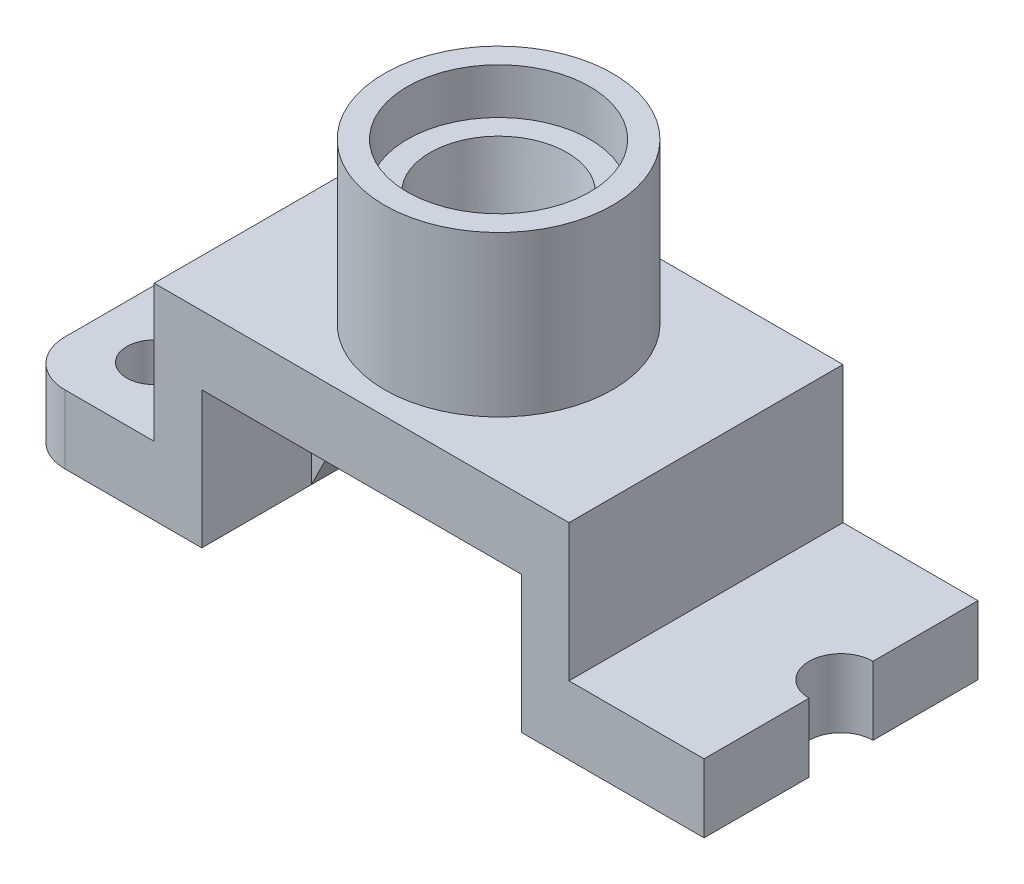
ISO-10303-21;
HEADER;
FILE_DESCRIPTION(('STEP AP214'),'2;1');
FILE_NAME('part.step','',(''),(''),'','','');
FILE_SCHEMA(('AUTOMOTIVE_DESIGN { 1 0 10303 214 1 1 1 1 }'));
ENDSEC;
DATA;
#1=APPLICATION_CONTEXT('core data for automotive mechanical design processes');
#2=APPLICATION_PROTOCOL_DEFINITION('international standard','automotive_design',2000,#1);
#3=PRODUCT_CONTEXT('',#1,'mechanical');
#4=PRODUCT('Part','Part','',(#3));
#5=PRODUCT_RELATED_PRODUCT_CATEGORY('part','',(#4));
#6=PRODUCT_DEFINITION_FORMATION('','',#4);
#7=PRODUCT_DEFINITION_CONTEXT('part definition',#1,'design');
#8=PRODUCT_DEFINITION('design','',#6,#7);
#9=PRODUCT_DEFINITION_SHAPE('','',#8);
#10=(LENGTH_UNIT() NAMED_UNIT(*) SI_UNIT(.MILLI.,.METRE.));
#11=(NAMED_UNIT(*) PLANE_ANGLE_UNIT() SI_UNIT($,.RADIAN.));
#12=(NAMED_UNIT(*) SI_UNIT($,.STERADIAN.) SOLID_ANGLE_UNIT());
#13=UNCERTAINTY_MEASURE_WITH_UNIT(LENGTH_MEASURE(1.E-05),#10,'distance_accuracy_value','');
#14=(GEOMETRIC_REPRESENTATION_CONTEXT(3) GLOBAL_UNCERTAINTY_ASSIGNED_CONTEXT((#13)) GLOBAL_UNIT_ASSIGNED_CONTEXT((#10,
#11,#12)) REPRESENTATION_CONTEXT('',''));
#15=CARTESIAN_POINT('',(0.,0.,0.));
#16=DIRECTION('',(0.,0.,1.));
#17=DIRECTION('',(1.,0.,0.));
#18=AXIS2_PLACEMENT_3D('',#15,#16,#17);
#19=CARTESIAN_POINT('',(75.,0.,30.));
#20=DIRECTION('',(-1.,0.,0.));
#21=DIRECTION('',(0.,0.,1.));
#22=AXIS2_PLACEMENT_3D('',#19,#20,#21);
#23=PLANE('',#22);
#24=DIRECTION('',(0.,0.,-1.));
#25=VECTOR('',#24,1.);
#26=CARTESIAN_POINT('',(75.,0.,30.));
#27=LINE('',#26,#25);
#28=CARTESIAN_POINT('',(75.,0.,30.));
#29=VERTEX_POINT('',#28);
#30=CARTESIAN_POINT('',(75.,0.,7.00000000000001));
#31=VERTEX_POINT('',#30);
#32=EDGE_CURVE('E206',#29,#31,#27,.T.);
#33=ORIENTED_EDGE('',*,*,#32,.T.);
#34=DIRECTION('',(0.,1.,0.));
#35=VECTOR('',#34,1.);
#36=CARTESIAN_POINT('',(75.,-7.,7.00000000000001));
#37=LINE('',#36,#35);
#38=CARTESIAN_POINT('',(75.,15.,7.00000000000001));
#39=VERTEX_POINT('',#38);
#40=EDGE_CURVE('E193',#31,#39,#37,.T.);
#41=ORIENTED_EDGE('',*,*,#40,.T.);
#42=DIRECTION('',(0.,0.,-1.));
#43=VECTOR('',#42,1.);
#44=CARTESIAN_POINT('',(75.,15.,30.));
#45=LINE('',#44,#43);
#46=CARTESIAN_POINT('',(75.,15.,30.));
#47=VERTEX_POINT('',#46);
#48=EDGE_CURVE('E203',#47,#39,#45,.T.);
#49=ORIENTED_EDGE('',*,*,#48,.F.);
#50=DIRECTION('',(0.,1.,0.));
#51=VECTOR('',#50,1.);
#52=CARTESIAN_POINT('',(75.,0.,30.));
#53=LINE('',#52,#51);
#54=EDGE_CURVE('E283',#29,#47,#53,.T.);
#55=ORIENTED_EDGE('',*,*,#54,.F.);
#56=EDGE_LOOP('',(#33,#41,#49,#55));
#57=FACE_BOUND('',#56,.T.);
#58=ADVANCED_FACE('F42',(#57),#23,.F.);
#59=CARTESIAN_POINT('',(35.,30.,30.));
#60=DIRECTION('',(1.,0.,0.));
#61=DIRECTION('',(0.,0.,-1.));
#62=AXIS2_PLACEMENT_3D('',#59,#60,#61);
#63=PLANE('',#62);
#64=DIRECTION('',(0.,-1.,0.));
#65=VECTOR('',#64,1.);
#66=CARTESIAN_POINT('',(35.,0.,-6.));
#67=LINE('',#66,#65);
#68=CARTESIAN_POINT('',(35.,30.,-6.));
#69=VERTEX_POINT('',#68);
#70=CARTESIAN_POINT('',(35.,0.,-5.99999999999999));
#71=VERTEX_POINT('',#70);
#72=EDGE_CURVE('E375',#69,#71,#67,.T.);
#73=ORIENTED_EDGE('',*,*,#72,.F.);
#74=DIRECTION('',(0.,0.,-1.));
#75=VECTOR('',#74,1.);
#76=CARTESIAN_POINT('',(35.,30.,30.));
#77=LINE('',#76,#75);
#78=CARTESIAN_POINT('',(35.,30.,-30.));
#79=VERTEX_POINT('',#78);
#80=EDGE_CURVE('E225',#69,#79,#77,.T.);
#81=ORIENTED_EDGE('',*,*,#80,.T.);
#82=DIRECTION('',(0.,-1.,0.));
#83=VECTOR('',#82,1.);
#84=CARTESIAN_POINT('',(35.,30.,-30.));
#85=LINE('',#84,#83);
#86=CARTESIAN_POINT('',(35.,0.,-30.));
#87=VERTEX_POINT('',#86);
#88=EDGE_CURVE('E302',#79,#87,#85,.T.);
#89=ORIENTED_EDGE('',*,*,#88,.T.);
#90=DIRECTION('',(0.,0.,-1.));
#91=VECTOR('',#90,1.);
#92=CARTESIAN_POINT('',(35.,0.,30.));
#93=LINE('',#92,#91);
#94=EDGE_CURVE('E221',#71,#87,#93,.T.);
#95=ORIENTED_EDGE('',*,*,#94,.F.);
#96=EDGE_LOOP('',(#73,#81,#89,#95));
#97=FACE_BOUND('',#96,.T.);
#98=ADVANCED_FACE('F432',(#97),#63,.F.);
#99=CARTESIAN_POINT('',(-35.,0.,30.));
#100=DIRECTION('',(-1.,0.,0.));
#101=DIRECTION('',(0.,0.,1.));
#102=AXIS2_PLACEMENT_3D('',#99,#100,#101);
#103=PLANE('',#102);
#104=DIRECTION('',(0.,1.,0.));
#105=VECTOR('',#104,1.);
#106=CARTESIAN_POINT('',(-35.,0.,-6.));
#107=LINE('',#106,#105);
#108=CARTESIAN_POINT('',(-35.,0.,-5.99999999999999));
#109=VERTEX_POINT('',#108);
#110=CARTESIAN_POINT('',(-35.,30.,-5.99999999999999));
#111=VERTEX_POINT('',#110);
#112=EDGE_CURVE('E391',#109,#111,#107,.T.);
#113=ORIENTED_EDGE('',*,*,#112,.F.);
#114=DIRECTION('',(0.,0.,-1.));
#115=VECTOR('',#114,1.);
#116=CARTESIAN_POINT('',(-35.,0.,30.));
#117=LINE('',#116,#115);
#118=CARTESIAN_POINT('',(-35.,0.,-30.));
#119=VERTEX_POINT('',#118);
#120=EDGE_CURVE('E233',#109,#119,#117,.T.);
#121=ORIENTED_EDGE('',*,*,#120,.T.);
#122=DIRECTION('',(0.,1.,0.));
#123=VECTOR('',#122,1.);
#124=CARTESIAN_POINT('',(-35.,0.,-30.));
#125=LINE('',#124,#123);
#126=CARTESIAN_POINT('',(-35.,30.,-30.));
#127=VERTEX_POINT('',#126);
#128=EDGE_CURVE('E296',#119,#127,#125,.T.);
#129=ORIENTED_EDGE('',*,*,#128,.T.);
#130=DIRECTION('',(0.,0.,-1.));
#131=VECTOR('',#130,1.);
#132=CARTESIAN_POINT('',(-35.,30.,30.));
#133=LINE('',#132,#131);
#134=EDGE_CURVE('E229',#111,#127,#133,.T.);
#135=ORIENTED_EDGE('',*,*,#134,.F.);
#136=EDGE_LOOP('',(#113,#121,#129,#135));
#137=FACE_BOUND('',#136,.T.);
#138=ADVANCED_FACE('F422',(#137),#103,.F.);
#139=CARTESIAN_POINT('',(-75.,15.,30.));
#140=DIRECTION('',(1.,0.,0.));
#141=DIRECTION('',(0.,0.,-1.));
#142=AXIS2_PLACEMENT_3D('',#139,#140,#141);
#143=PLANE('',#142);
#144=DIRECTION('',(0.,0.,-1.));
#145=VECTOR('',#144,1.);
#146=CARTESIAN_POINT('',(-75.,15.,30.));
#147=LINE('',#146,#145);
#148=CARTESIAN_POINT('',(-75.,15.,20.));
#149=VERTEX_POINT('',#148);
#150=CARTESIAN_POINT('',(-75.,15.,-20.));
#151=VERTEX_POINT('',#150);
#152=EDGE_CURVE('E293',#149,#151,#147,.T.);
#153=ORIENTED_EDGE('',*,*,#152,.T.);
#154=DIRECTION('',(0.,-1.,0.));
#155=VECTOR('',#154,1.);
#156=CARTESIAN_POINT('',(-75.,15.,-20.));
#157=LINE('',#156,#155);
#158=CARTESIAN_POINT('',(-75.,0.,-20.));
#159=VERTEX_POINT('',#158);
#160=EDGE_CURVE('E242',#151,#159,#157,.T.);
#161=ORIENTED_EDGE('',*,*,#160,.T.);
#162=DIRECTION('',(0.,0.,-1.));
#163=VECTOR('',#162,1.);
#164=CARTESIAN_POINT('',(-75.,0.,30.));
#165=LINE('',#164,#163);
#166=CARTESIAN_POINT('',(-75.,0.,20.));
#167=VERTEX_POINT('',#166);
#168=EDGE_CURVE('E237',#167,#159,#165,.T.);
#169=ORIENTED_EDGE('',*,*,#168,.F.);
#170=DIRECTION('',(0.,-1.,0.));
#171=VECTOR('',#170,1.);
#172=CARTESIAN_POINT('',(-75.,15.,20.));
#173=LINE('',#172,#171);
#174=EDGE_CURVE('E240',#167,#149,#173,.F.);
#175=ORIENTED_EDGE('',*,*,#174,.T.);
#176=EDGE_LOOP('',(#153,#161,#169,#175));
#177=FACE_BOUND('',#176,.T.);
#178=ADVANCED_FACE('F463',(#177),#143,.F.);
#179=CARTESIAN_POINT('',(-75.,0.,30.));
#180=DIRECTION('',(0.,1.,0.));
#181=DIRECTION('',(0.,0.,1.));
#182=AXIS2_PLACEMENT_3D('',#179,#180,#181);
#183=PLANE('',#182);
#184=CARTESIAN_POINT('',(-60.4225352112676,0.,15.));
#185=DIRECTION('',(0.,1.,0.));
#186=DIRECTION('',(-1.,0.,0.));
#187=AXIS2_PLACEMENT_3D('',#184,#185,#186);
#188=CIRCLE('',#187,5.99999999999999);
#189=CARTESIAN_POINT('',(-66.4225352112676,0.,15.));
#190=VERTEX_POINT('',#189);
#191=EDGE_CURVE('E359',#190,#190,#188,.T.);
#192=ORIENTED_EDGE('',*,*,#191,.T.);
#193=EDGE_LOOP('',(#192));
#194=FACE_BOUND('',#193,.T.);
#195=CARTESIAN_POINT('',(-60.4225352112676,0.,-15.));
#196=DIRECTION('',(0.,1.,0.));
#197=DIRECTION('',(-1.,0.,0.));
#198=AXIS2_PLACEMENT_3D('',#195,#196,#197);
#199=CIRCLE('',#198,6.);
#200=CARTESIAN_POINT('',(-66.4225352112676,0.,-15.));
#201=VERTEX_POINT('',#200);
#202=EDGE_CURVE('E366',#201,#201,#199,.T.);
#203=ORIENTED_EDGE('',*,*,#202,.T.);
#204=EDGE_LOOP('',(#203));
#205=FACE_BOUND('',#204,.T.);
#206=ORIENTED_EDGE('',*,*,#168,.T.);
#207=CARTESIAN_POINT('',(-65.,0.,-20.));
#208=DIRECTION('',(0.,1.,0.));
#209=DIRECTION('',(0.,0.,1.));
#210=AXIS2_PLACEMENT_3D('',#207,#208,#209);
#211=CIRCLE('',#210,10.);
#212=CARTESIAN_POINT('',(-65.,0.,-30.));
#213=VERTEX_POINT('',#212);
#214=EDGE_CURVE('E247',#159,#213,#211,.F.);
#215=ORIENTED_EDGE('',*,*,#214,.T.);
#216=DIRECTION('',(1.,0.,0.));
#217=VECTOR('',#216,1.);
#218=CARTESIAN_POINT('',(-75.,0.,-30.));
#219=LINE('',#218,#217);
#220=EDGE_CURVE('E294',#213,#119,#219,.T.);
#221=ORIENTED_EDGE('',*,*,#220,.T.);
#222=ORIENTED_EDGE('',*,*,#120,.F.);
#223=DIRECTION('',(0.,0.,-1.));
#224=VECTOR('',#223,1.);
#225=CARTESIAN_POINT('',(-35.,0.,6.));
#226=LINE('',#225,#224);
#227=CARTESIAN_POINT('',(-35.,0.,6.00000000000001));
#228=VERTEX_POINT('',#227);
#229=EDGE_CURVE('E275',#228,#109,#226,.T.);
#230=ORIENTED_EDGE('',*,*,#229,.F.);
#231=CARTESIAN_POINT('',(-35.,0.,30.));
#232=VERTEX_POINT('',#231);
#233=EDGE_CURVE('E234',#232,#228,#117,.T.);
#234=ORIENTED_EDGE('',*,*,#233,.F.);
#235=DIRECTION('',(1.,0.,0.));
#236=VECTOR('',#235,1.);
#237=CARTESIAN_POINT('',(-75.,0.,30.));
#238=LINE('',#237,#236);
#239=CARTESIAN_POINT('',(-65.,0.,30.));
#240=VERTEX_POINT('',#239);
#241=EDGE_CURVE('E258',#240,#232,#238,.T.);
#242=ORIENTED_EDGE('',*,*,#241,.F.);
#243=CARTESIAN_POINT('',(-65.,0.,20.));
#244=DIRECTION('',(0.,1.,0.));
#245=DIRECTION('',(0.,0.,1.));
#246=AXIS2_PLACEMENT_3D('',#243,#244,#245);
#247=CIRCLE('',#246,10.);
#248=EDGE_CURVE('E245',#240,#167,#247,.F.);
#249=ORIENTED_EDGE('',*,*,#248,.T.);
#250=EDGE_LOOP('',(#206,#215,#221,#222,#230,#234,#242,#249));
#251=FACE_BOUND('',#250,.T.);
#252=ADVANCED_FACE('F263',(#194,#205,#251),#183,.F.);
#253=ORIENTED_EDGE('',*,*,#233,.T.);
#254=DIRECTION('',(0.,1.,0.));
#255=VECTOR('',#254,1.);
#256=CARTESIAN_POINT('',(-35.,0.,6.));
#257=LINE('',#256,#255);
#258=CARTESIAN_POINT('',(-35.,30.,6.00000000000001));
#259=VERTEX_POINT('',#258);
#260=EDGE_CURVE('E392',#228,#259,#257,.T.);
#261=ORIENTED_EDGE('',*,*,#260,.T.);
#262=CARTESIAN_POINT('',(-35.,30.,30.));
#263=VERTEX_POINT('',#262);
#264=EDGE_CURVE('E230',#263,#259,#133,.T.);
#265=ORIENTED_EDGE('',*,*,#264,.F.);
#266=DIRECTION('',(0.,1.,0.));
#267=VECTOR('',#266,1.);
#268=CARTESIAN_POINT('',(-35.,0.,30.));
#269=LINE('',#268,#267);
#270=EDGE_CURVE('E266',#232,#263,#269,.T.);
#271=ORIENTED_EDGE('',*,*,#270,.F.);
#272=EDGE_LOOP('',(#253,#261,#265,#271));
#273=FACE_BOUND('',#272,.T.);
#274=ADVANCED_FACE('F465',(#273),#103,.F.);
#275=CARTESIAN_POINT('',(-35.,30.,30.));
#276=DIRECTION('',(0.,1.,0.));
#277=DIRECTION('',(0.,0.,1.));
#278=AXIS2_PLACEMENT_3D('',#275,#276,#277);
#279=PLANE('',#278);
#280=CARTESIAN_POINT('',(0.,30.,0.));
#281=DIRECTION('',(0.,-1.,0.));
#282=DIRECTION('',(0.,0.,-1.));
#283=AXIS2_PLACEMENT_3D('',#280,#281,#282);
#284=CIRCLE('',#283,10.);
#285=CARTESIAN_POINT('',(0.,30.,-10.));
#286=VERTEX_POINT('',#285);
#287=EDGE_CURVE('E739',#286,#286,#284,.T.);
#288=ORIENTED_EDGE('',*,*,#287,.F.);
#289=EDGE_LOOP('',(#288));
#290=FACE_BOUND('',#289,.T.);
#291=DIRECTION('',(0.,0.,-1.));
#292=VECTOR('',#291,1.);
#293=CARTESIAN_POINT('',(20.,30.,6.));
#294=LINE('',#293,#292);
#295=CARTESIAN_POINT('',(20.,30.,6.));
#296=VERTEX_POINT('',#295);
#297=CARTESIAN_POINT('',(20.,30.,-6.));
#298=VERTEX_POINT('',#297);
#299=EDGE_CURVE('E389',#296,#298,#294,.T.);
#300=ORIENTED_EDGE('',*,*,#299,.F.);
#301=DIRECTION('',(1.,0.,0.));
#302=VECTOR('',#301,1.);
#303=CARTESIAN_POINT('',(0.,30.,6.));
#304=LINE('',#303,#302);
#305=CARTESIAN_POINT('',(35.,30.,6.));
#306=VERTEX_POINT('',#305);
#307=EDGE_CURVE('E371',#296,#306,#304,.T.);
#308=ORIENTED_EDGE('',*,*,#307,.T.);
#309=CARTESIAN_POINT('',(35.,30.,30.));
#310=VERTEX_POINT('',#309);
#311=EDGE_CURVE('E226',#310,#306,#77,.T.);
#312=ORIENTED_EDGE('',*,*,#311,.F.);
#313=DIRECTION('',(1.,0.,0.));
#314=VECTOR('',#313,1.);
#315=CARTESIAN_POINT('',(-35.,30.,30.));
#316=LINE('',#315,#314);
#317=EDGE_CURVE('E269',#263,#310,#316,.T.);
#318=ORIENTED_EDGE('',*,*,#317,.F.);
#319=ORIENTED_EDGE('',*,*,#264,.T.);
#320=DIRECTION('',(1.,0.,0.));
#321=VECTOR('',#320,1.);
#322=CARTESIAN_POINT('',(0.,30.,6.));
#323=LINE('',#322,#321);
#324=CARTESIAN_POINT('',(-20.,30.,6.));
#325=VERTEX_POINT('',#324);
#326=EDGE_CURVE('E398',#259,#325,#323,.T.);
#327=ORIENTED_EDGE('',*,*,#326,.T.);
#328=DIRECTION('',(0.,0.,-1.));
#329=VECTOR('',#328,1.);
#330=CARTESIAN_POINT('',(-20.,30.,6.));
#331=LINE('',#330,#329);
#332=CARTESIAN_POINT('',(-20.,30.,-6.));
#333=VERTEX_POINT('',#332);
#334=EDGE_CURVE('E400',#325,#333,#331,.T.);
#335=ORIENTED_EDGE('',*,*,#334,.T.);
#336=DIRECTION('',(1.,0.,0.));
#337=VECTOR('',#336,1.);
#338=CARTESIAN_POINT('',(0.,30.,-6.));
#339=LINE('',#338,#337);
#340=EDGE_CURVE('E395',#111,#333,#339,.T.);
#341=ORIENTED_EDGE('',*,*,#340,.F.);
#342=ORIENTED_EDGE('',*,*,#134,.T.);
#343=DIRECTION('',(1.,0.,0.));
#344=VECTOR('',#343,1.);
#345=CARTESIAN_POINT('',(-35.,30.,-30.));
#346=LINE('',#345,#344);
#347=EDGE_CURVE('E299',#127,#79,#346,.T.);
#348=ORIENTED_EDGE('',*,*,#347,.T.);
#349=ORIENTED_EDGE('',*,*,#80,.F.);
#350=DIRECTION('',(1.,0.,0.));
#351=VECTOR('',#350,1.);
#352=CARTESIAN_POINT('',(0.,30.,-6.));
#353=LINE('',#352,#351);
#354=EDGE_CURVE('E362',#298,#69,#353,.T.);
#355=ORIENTED_EDGE('',*,*,#354,.F.);
#356=EDGE_LOOP('',(#300,#308,#312,#318,#319,#327,#335,#341,#342,#348,#349,#355));
#357=FACE_BOUND('',#356,.T.);
#358=ADVANCED_FACE('F420',(#290,#357),#279,.F.);
#359=ORIENTED_EDGE('',*,*,#311,.T.);
#360=DIRECTION('',(0.,-1.,0.));
#361=VECTOR('',#360,1.);
#362=CARTESIAN_POINT('',(35.,0.,6.));
#363=LINE('',#362,#361);
#364=CARTESIAN_POINT('',(35.,0.,6.));
#365=VERTEX_POINT('',#364);
#366=EDGE_CURVE('E378',#306,#365,#363,.T.);
#367=ORIENTED_EDGE('',*,*,#366,.T.);
#368=CARTESIAN_POINT('',(35.,0.,30.));
#369=VERTEX_POINT('',#368);
#370=EDGE_CURVE('E222',#369,#365,#93,.T.);
#371=ORIENTED_EDGE('',*,*,#370,.F.);
#372=DIRECTION('',(0.,-1.,0.));
#373=VECTOR('',#372,1.);
#374=CARTESIAN_POINT('',(35.,30.,30.));
#375=LINE('',#374,#373);
#376=EDGE_CURVE('E279',#310,#369,#375,.T.);
#377=ORIENTED_EDGE('',*,*,#376,.F.);
#378=EDGE_LOOP('',(#359,#367,#371,#377));
#379=FACE_BOUND('',#378,.T.);
#380=ADVANCED_FACE('F444',(#379),#63,.F.);
#381=CARTESIAN_POINT('',(35.,0.,30.));
#382=DIRECTION('',(0.,1.,0.));
#383=DIRECTION('',(0.,0.,1.));
#384=AXIS2_PLACEMENT_3D('',#381,#382,#383);
#385=PLANE('',#384);
#386=CARTESIAN_POINT('',(75.,0.,-6.99999999999999));
#387=VERTEX_POINT('',#386);
#388=CARTESIAN_POINT('',(75.,0.,-30.));
#389=VERTEX_POINT('',#388);
#390=EDGE_CURVE('E213',#387,#389,#27,.T.);
#391=ORIENTED_EDGE('',*,*,#390,.F.);
#392=CARTESIAN_POINT('',(75.,0.,0.));
#393=DIRECTION('',(0.,1.,0.));
#394=DIRECTION('',(0.,0.,1.));
#395=AXIS2_PLACEMENT_3D('',#392,#393,#394);
#396=CIRCLE('',#395,7.);
#397=EDGE_CURVE('E208',#387,#31,#396,.T.);
#398=ORIENTED_EDGE('',*,*,#397,.T.);
#399=ORIENTED_EDGE('',*,*,#32,.F.);
#400=DIRECTION('',(1.,0.,0.));
#401=VECTOR('',#400,1.);
#402=CARTESIAN_POINT('',(35.,0.,30.));
#403=LINE('',#402,#401);
#404=EDGE_CURVE('E281',#369,#29,#403,.T.);
#405=ORIENTED_EDGE('',*,*,#404,.F.);
#406=ORIENTED_EDGE('',*,*,#370,.T.);
#407=DIRECTION('',(0.,0.,-1.));
#408=VECTOR('',#407,1.);
#409=CARTESIAN_POINT('',(35.,0.,6.));
#410=LINE('',#409,#408);
#411=EDGE_CURVE('E381',#365,#71,#410,.T.);
#412=ORIENTED_EDGE('',*,*,#411,.T.);
#413=ORIENTED_EDGE('',*,*,#94,.T.);
#414=DIRECTION('',(1.,0.,0.));
#415=VECTOR('',#414,1.);
#416=CARTESIAN_POINT('',(35.,0.,-30.));
#417=LINE('',#416,#415);
#418=EDGE_CURVE('E305',#87,#389,#417,.T.);
#419=ORIENTED_EDGE('',*,*,#418,.T.);
#420=EDGE_LOOP('',(#391,#398,#399,#405,#406,#412,#413,#419));
#421=FACE_BOUND('',#420,.T.);
#422=ADVANCED_FACE('F354',(#421),#385,.F.);
#423=CARTESIAN_POINT('',(75.,15.,-6.99999999999999));
#424=VERTEX_POINT('',#423);
#425=CARTESIAN_POINT('',(75.,15.,-30.));
#426=VERTEX_POINT('',#425);
#427=EDGE_CURVE('E214',#424,#426,#45,.T.);
#428=ORIENTED_EDGE('',*,*,#427,.F.);
#429=DIRECTION('',(0.,1.,0.));
#430=VECTOR('',#429,1.);
#431=CARTESIAN_POINT('',(75.,-7.,-6.99999999999999));
#432=LINE('',#431,#430);
#433=EDGE_CURVE('E58',#424,#387,#432,.F.);
#434=ORIENTED_EDGE('',*,*,#433,.T.);
#435=ORIENTED_EDGE('',*,*,#390,.T.);
#436=DIRECTION('',(0.,1.,0.));
#437=VECTOR('',#436,1.);
#438=CARTESIAN_POINT('',(75.,0.,-30.));
#439=LINE('',#438,#437);
#440=EDGE_CURVE('E308',#389,#426,#439,.T.);
#441=ORIENTED_EDGE('',*,*,#440,.T.);
#442=EDGE_LOOP('',(#428,#434,#435,#441));
#443=FACE_BOUND('',#442,.T.);
#444=ADVANCED_FACE('F446',(#443),#23,.F.);
#445=CARTESIAN_POINT('',(75.,15.,30.));
#446=DIRECTION('',(0.,-1.,0.));
#447=DIRECTION('',(1.,0.,0.));
#448=AXIS2_PLACEMENT_3D('',#445,#446,#447);
#449=PLANE('',#448);
#450=ORIENTED_EDGE('',*,*,#48,.T.);
#451=CARTESIAN_POINT('',(75.,15.,0.));
#452=DIRECTION('',(0.,-1.,0.));
#453=DIRECTION('',(1.,0.,0.));
#454=AXIS2_PLACEMENT_3D('',#451,#452,#453);
#455=CIRCLE('',#454,7.);
#456=EDGE_CURVE('E46',#39,#424,#455,.T.);
#457=ORIENTED_EDGE('',*,*,#456,.T.);
#458=ORIENTED_EDGE('',*,*,#427,.T.);
#459=DIRECTION('',(-1.,0.,0.));
#460=VECTOR('',#459,1.);
#461=CARTESIAN_POINT('',(75.,15.,-30.));
#462=LINE('',#461,#460);
#463=CARTESIAN_POINT('',(45.4225352112676,15.,-30.));
#464=VERTEX_POINT('',#463);
#465=EDGE_CURVE('E311',#426,#464,#462,.T.);
#466=ORIENTED_EDGE('',*,*,#465,.T.);
#467=DIRECTION('',(0.,0.,-1.));
#468=VECTOR('',#467,1.);
#469=CARTESIAN_POINT('',(45.4225352112676,15.,30.));
#470=LINE('',#469,#468);
#471=CARTESIAN_POINT('',(45.4225352112676,15.,30.));
#472=VERTEX_POINT('',#471);
#473=EDGE_CURVE('E217',#472,#464,#470,.T.);
#474=ORIENTED_EDGE('',*,*,#473,.F.);
#475=DIRECTION('',(-1.,0.,0.));
#476=VECTOR('',#475,1.);
#477=CARTESIAN_POINT('',(75.,15.,30.));
#478=LINE('',#477,#476);
#479=EDGE_CURVE('E212',#47,#472,#478,.T.);
#480=ORIENTED_EDGE('',*,*,#479,.F.);
#481=EDGE_LOOP('',(#450,#457,#458,#466,#474,#480));
#482=FACE_BOUND('',#481,.T.);
#483=ADVANCED_FACE('F210',(#482),#449,.F.);
#484=CARTESIAN_POINT('',(45.4225352112676,15.,30.));
#485=DIRECTION('',(-1.,0.,0.));
#486=DIRECTION('',(0.,-1.,0.));
#487=AXIS2_PLACEMENT_3D('',#484,#485,#486);
#488=PLANE('',#487);
#489=DIRECTION('',(0.,1.,0.));
#490=VECTOR('',#489,1.);
#491=CARTESIAN_POINT('',(45.4225352112676,15.,-30.));
#492=LINE('',#491,#490);
#493=CARTESIAN_POINT('',(45.4225352112676,45.,-30.));
#494=VERTEX_POINT('',#493);
#495=EDGE_CURVE('E313',#464,#494,#492,.T.);
#496=ORIENTED_EDGE('',*,*,#495,.T.);
#497=DIRECTION('',(0.,0.,-1.));
#498=VECTOR('',#497,1.);
#499=CARTESIAN_POINT('',(45.4225352112676,45.,30.));
#500=LINE('',#499,#498);
#501=CARTESIAN_POINT('',(45.4225352112676,45.,30.));
#502=VERTEX_POINT('',#501);
#503=EDGE_CURVE('E325',#502,#494,#500,.T.);
#504=ORIENTED_EDGE('',*,*,#503,.F.);
#505=DIRECTION('',(0.,1.,0.));
#506=VECTOR('',#505,1.);
#507=CARTESIAN_POINT('',(45.4225352112676,15.,30.));
#508=LINE('',#507,#506);
#509=EDGE_CURVE('E286',#472,#502,#508,.T.);
#510=ORIENTED_EDGE('',*,*,#509,.F.);
#511=ORIENTED_EDGE('',*,*,#473,.T.);
#512=EDGE_LOOP('',(#496,#504,#510,#511));
#513=FACE_BOUND('',#512,.T.);
#514=ADVANCED_FACE('F335',(#513),#488,.F.);
#515=CARTESIAN_POINT('',(45.4225352112676,45.,30.));
#516=DIRECTION('',(0.,-1.,0.));
#517=DIRECTION('',(0.,0.,-1.));
#518=AXIS2_PLACEMENT_3D('',#515,#516,#517);
#519=PLANE('',#518);
#520=CARTESIAN_POINT('',(0.,45.,0.));
#521=DIRECTION('',(0.,1.,0.));
#522=DIRECTION('',(0.,0.,1.));
#523=AXIS2_PLACEMENT_3D('',#520,#521,#522);
#524=CIRCLE('',#523,25.);
#525=CARTESIAN_POINT('',(0.,45.,25.));
#526=VERTEX_POINT('',#525);
#527=EDGE_CURVE('E12',#526,#526,#524,.T.);
#528=ORIENTED_EDGE('',*,*,#527,.F.);
#529=EDGE_LOOP('',(#528));
#530=FACE_BOUND('',#529,.T.);
#531=DIRECTION('',(-1.,0.,0.));
#532=VECTOR('',#531,1.);
#533=CARTESIAN_POINT('',(45.4225352112676,45.,-30.));
#534=LINE('',#533,#532);
#535=CARTESIAN_POINT('',(-45.4225352112676,45.,-30.));
#536=VERTEX_POINT('',#535);
#537=EDGE_CURVE('E315',#494,#536,#534,.T.);
#538=ORIENTED_EDGE('',*,*,#537,.T.);
#539=DIRECTION('',(0.,0.,-1.));
#540=VECTOR('',#539,1.);
#541=CARTESIAN_POINT('',(-45.4225352112676,45.,30.));
#542=LINE('',#541,#540);
#543=CARTESIAN_POINT('',(-45.4225352112676,45.,30.));
#544=VERTEX_POINT('',#543);
#545=EDGE_CURVE('E323',#544,#536,#542,.T.);
#546=ORIENTED_EDGE('',*,*,#545,.F.);
#547=DIRECTION('',(-1.,0.,0.));
#548=VECTOR('',#547,1.);
#549=CARTESIAN_POINT('',(45.4225352112676,45.,30.));
#550=LINE('',#549,#548);
#551=EDGE_CURVE('E288',#502,#544,#550,.T.);
#552=ORIENTED_EDGE('',*,*,#551,.F.);
#553=ORIENTED_EDGE('',*,*,#503,.T.);
#554=EDGE_LOOP('',(#538,#546,#552,#553));
#555=FACE_BOUND('',#554,.T.);
#556=ADVANCED_FACE('F344',(#530,#555),#519,.F.);
#557=CARTESIAN_POINT('',(-45.4225352112676,45.,30.));
#558=DIRECTION('',(1.,0.,0.));
#559=DIRECTION('',(0.,1.,0.));
#560=AXIS2_PLACEMENT_3D('',#557,#558,#559);
#561=PLANE('',#560);
#562=DIRECTION('',(0.,-1.,0.));
#563=VECTOR('',#562,1.);
#564=CARTESIAN_POINT('',(-45.4225352112676,45.,-30.));
#565=LINE('',#564,#563);
#566=CARTESIAN_POINT('',(-45.4225352112676,15.,-30.));
#567=VERTEX_POINT('',#566);
#568=EDGE_CURVE('E272',#536,#567,#565,.T.);
#569=ORIENTED_EDGE('',*,*,#568,.T.);
#570=DIRECTION('',(0.,0.,-1.));
#571=VECTOR('',#570,1.);
#572=CARTESIAN_POINT('',(-45.4225352112676,15.,30.));
#573=LINE('',#572,#571);
#574=CARTESIAN_POINT('',(-45.4225352112676,15.,30.));
#575=VERTEX_POINT('',#574);
#576=EDGE_CURVE('E320',#575,#567,#573,.T.);
#577=ORIENTED_EDGE('',*,*,#576,.F.);
#578=DIRECTION('',(0.,-1.,0.));
#579=VECTOR('',#578,1.);
#580=CARTESIAN_POINT('',(-45.4225352112676,45.,30.));
#581=LINE('',#580,#579);
#582=EDGE_CURVE('E290',#544,#575,#581,.T.);
#583=ORIENTED_EDGE('',*,*,#582,.F.);
#584=ORIENTED_EDGE('',*,*,#545,.T.);
#585=EDGE_LOOP('',(#569,#577,#583,#584));
#586=FACE_BOUND('',#585,.T.);
#587=ADVANCED_FACE('F347',(#586),#561,.F.);
#588=CARTESIAN_POINT('',(-45.4225352112676,15.,30.));
#589=DIRECTION('',(0.,-1.,0.));
#590=DIRECTION('',(1.,0.,0.));
#591=AXIS2_PLACEMENT_3D('',#588,#589,#590);
#592=PLANE('',#591);
#593=CARTESIAN_POINT('',(-60.4225352112676,15.,15.));
#594=DIRECTION('',(0.,1.,0.));
#595=DIRECTION('',(-1.,0.,0.));
#596=AXIS2_PLACEMENT_3D('',#593,#594,#595);
#597=CIRCLE('',#596,5.99999999999999);
#598=CARTESIAN_POINT('',(-66.4225352112676,15.,15.));
#599=VERTEX_POINT('',#598);
#600=EDGE_CURVE('E363',#599,#599,#597,.T.);
#601=ORIENTED_EDGE('',*,*,#600,.F.);
#602=EDGE_LOOP('',(#601));
#603=FACE_BOUND('',#602,.T.);
#604=CARTESIAN_POINT('',(-60.4225352112676,15.,-15.));
#605=DIRECTION('',(0.,1.,0.));
#606=DIRECTION('',(-1.,0.,0.));
#607=AXIS2_PLACEMENT_3D('',#604,#605,#606);
#608=CIRCLE('',#607,6.);
#609=CARTESIAN_POINT('',(-66.4225352112676,15.,-15.));
#610=VERTEX_POINT('',#609);
#611=EDGE_CURVE('E207',#610,#610,#608,.T.);
#612=ORIENTED_EDGE('',*,*,#611,.F.);
#613=EDGE_LOOP('',(#612));
#614=FACE_BOUND('',#613,.T.);
#615=DIRECTION('',(-1.,0.,0.));
#616=VECTOR('',#615,1.);
#617=CARTESIAN_POINT('',(-45.4225352112676,15.,-30.));
#618=LINE('',#617,#616);
#619=CARTESIAN_POINT('',(-65.,15.,-30.));
#620=VERTEX_POINT('',#619);
#621=EDGE_CURVE('E267',#567,#620,#618,.T.);
#622=ORIENTED_EDGE('',*,*,#621,.T.);
#623=CARTESIAN_POINT('',(-65.,15.,-20.));
#624=DIRECTION('',(0.,-1.,0.));
#625=DIRECTION('',(1.,0.,0.));
#626=AXIS2_PLACEMENT_3D('',#623,#624,#625);
#627=CIRCLE('',#626,10.);
#628=EDGE_CURVE('E252',#620,#151,#627,.F.);
#629=ORIENTED_EDGE('',*,*,#628,.T.);
#630=ORIENTED_EDGE('',*,*,#152,.F.);
#631=CARTESIAN_POINT('',(-65.,15.,20.));
#632=DIRECTION('',(0.,-1.,0.));
#633=DIRECTION('',(1.,0.,0.));
#634=AXIS2_PLACEMENT_3D('',#631,#632,#633);
#635=CIRCLE('',#634,10.);
#636=CARTESIAN_POINT('',(-65.,15.,30.));
#637=VERTEX_POINT('',#636);
#638=EDGE_CURVE('E66',#149,#637,#635,.F.);
#639=ORIENTED_EDGE('',*,*,#638,.T.);
#640=DIRECTION('',(-1.,0.,0.));
#641=VECTOR('',#640,1.);
#642=CARTESIAN_POINT('',(-45.4225352112676,15.,30.));
#643=LINE('',#642,#641);
#644=EDGE_CURVE('E260',#575,#637,#643,.T.);
#645=ORIENTED_EDGE('',*,*,#644,.F.);
#646=ORIENTED_EDGE('',*,*,#576,.T.);
#647=EDGE_LOOP('',(#622,#629,#630,#639,#645,#646));
#648=FACE_BOUND('',#647,.T.);
#649=ADVANCED_FACE('F497',(#603,#614,#648),#592,.F.);
#650=CARTESIAN_POINT('',(0.,0.,30.));
#651=DIRECTION('',(0.,0.,1.));
#652=DIRECTION('',(1.,0.,0.));
#653=AXIS2_PLACEMENT_3D('',#650,#651,#652);
#654=PLANE('',#653);
#655=ORIENTED_EDGE('',*,*,#644,.T.);
#656=DIRECTION('',(0.,-1.,0.));
#657=VECTOR('',#656,1.);
#658=CARTESIAN_POINT('',(-65.,0.,30.));
#659=LINE('',#658,#657);
#660=EDGE_CURVE('E198',#637,#240,#659,.T.);
#661=ORIENTED_EDGE('',*,*,#660,.T.);
#662=ORIENTED_EDGE('',*,*,#241,.T.);
#663=ORIENTED_EDGE('',*,*,#270,.T.);
#664=ORIENTED_EDGE('',*,*,#317,.T.);
#665=ORIENTED_EDGE('',*,*,#376,.T.);
#666=ORIENTED_EDGE('',*,*,#404,.T.);
#667=ORIENTED_EDGE('',*,*,#54,.T.);
#668=ORIENTED_EDGE('',*,*,#479,.T.);
#669=ORIENTED_EDGE('',*,*,#509,.T.);
#670=ORIENTED_EDGE('',*,*,#551,.T.);
#671=ORIENTED_EDGE('',*,*,#582,.T.);
#672=EDGE_LOOP('',(#655,#661,#662,#663,#664,#665,#666,#667,#668,#669,#670,#671));
#673=FACE_BOUND('',#672,.T.);
#674=ADVANCED_FACE('F257',(#673),#654,.T.);
#675=CARTESIAN_POINT('',(0.,0.,-30.));
#676=DIRECTION('',(0.,0.,1.));
#677=DIRECTION('',(1.,0.,0.));
#678=AXIS2_PLACEMENT_3D('',#675,#676,#677);
#679=PLANE('',#678);
#680=ORIENTED_EDGE('',*,*,#220,.F.);
#681=DIRECTION('',(0.,-1.,0.));
#682=VECTOR('',#681,1.);
#683=CARTESIAN_POINT('',(-65.,0.,-30.));
#684=LINE('',#683,#682);
#685=EDGE_CURVE('E249',#213,#620,#684,.F.);
#686=ORIENTED_EDGE('',*,*,#685,.T.);
#687=ORIENTED_EDGE('',*,*,#621,.F.);
#688=ORIENTED_EDGE('',*,*,#568,.F.);
#689=ORIENTED_EDGE('',*,*,#537,.F.);
#690=ORIENTED_EDGE('',*,*,#495,.F.);
#691=ORIENTED_EDGE('',*,*,#465,.F.);
#692=ORIENTED_EDGE('',*,*,#440,.F.);
#693=ORIENTED_EDGE('',*,*,#418,.F.);
#694=ORIENTED_EDGE('',*,*,#88,.F.);
#695=ORIENTED_EDGE('',*,*,#347,.F.);
#696=ORIENTED_EDGE('',*,*,#128,.F.);
#697=EDGE_LOOP('',(#680,#686,#687,#688,#689,#690,#691,#692,#693,#694,#695,#696));
#698=FACE_BOUND('',#697,.T.);
#699=ADVANCED_FACE('F339',(#698),#679,.F.);
#700=CARTESIAN_POINT('',(-28.,14.,6.));
#701=DIRECTION('',(-0.894427190999916,0.447213595499958,0.));
#702=DIRECTION('',(-0.447213595499958,-0.894427190999916,0.));
#703=AXIS2_PLACEMENT_3D('',#700,#701,#702);
#704=PLANE('',#703);
#705=DIRECTION('',(0.447213595499958,0.894427190999916,0.));
#706=VECTOR('',#705,1.);
#707=CARTESIAN_POINT('',(-28.,14.,-6.));
#708=LINE('',#707,#706);
#709=EDGE_CURVE('E403',#109,#333,#708,.T.);
#710=ORIENTED_EDGE('',*,*,#709,.T.);
#711=ORIENTED_EDGE('',*,*,#334,.F.);
#712=DIRECTION('',(0.447213595499958,0.894427190999916,0.));
#713=VECTOR('',#712,1.);
#714=CARTESIAN_POINT('',(-28.,14.,6.));
#715=LINE('',#714,#713);
#716=EDGE_CURVE('E394',#228,#325,#715,.T.);
#717=ORIENTED_EDGE('',*,*,#716,.F.);
#718=ORIENTED_EDGE('',*,*,#229,.T.);
#719=EDGE_LOOP('',(#710,#711,#717,#718));
#720=FACE_BOUND('',#719,.T.);
#721=ADVANCED_FACE('F413',(#720),#704,.F.);
#722=CARTESIAN_POINT('',(0.,0.,6.));
#723=DIRECTION('',(0.,0.,1.));
#724=DIRECTION('',(1.,0.,0.));
#725=AXIS2_PLACEMENT_3D('',#722,#723,#724);
#726=PLANE('',#725);
#727=ORIENTED_EDGE('',*,*,#260,.F.);
#728=ORIENTED_EDGE('',*,*,#716,.T.);
#729=ORIENTED_EDGE('',*,*,#326,.F.);
#730=EDGE_LOOP('',(#727,#728,#729));
#731=FACE_BOUND('',#730,.T.);
#732=ADVANCED_FACE('F564',(#731),#726,.T.);
#733=CARTESIAN_POINT('',(0.,0.,-6.));
#734=DIRECTION('',(0.,0.,1.));
#735=DIRECTION('',(1.,0.,0.));
#736=AXIS2_PLACEMENT_3D('',#733,#734,#735);
#737=PLANE('',#736);
#738=ORIENTED_EDGE('',*,*,#112,.T.);
#739=ORIENTED_EDGE('',*,*,#340,.T.);
#740=ORIENTED_EDGE('',*,*,#709,.F.);
#741=EDGE_LOOP('',(#738,#739,#740));
#742=FACE_BOUND('',#741,.T.);
#743=ADVANCED_FACE('F417',(#742),#737,.F.);
#744=CARTESIAN_POINT('',(28.,14.,6.));
#745=DIRECTION('',(-0.894427190999916,-0.447213595499958,0.));
#746=DIRECTION('',(0.447213595499958,-0.894427190999916,0.));
#747=AXIS2_PLACEMENT_3D('',#744,#745,#746);
#748=PLANE('',#747);
#749=DIRECTION('',(-0.447213595499958,0.894427190999916,0.));
#750=VECTOR('',#749,1.);
#751=CARTESIAN_POINT('',(28.,14.,-6.));
#752=LINE('',#751,#750);
#753=EDGE_CURVE('E383',#71,#298,#752,.T.);
#754=ORIENTED_EDGE('',*,*,#753,.F.);
#755=ORIENTED_EDGE('',*,*,#411,.F.);
#756=DIRECTION('',(-0.447213595499958,0.894427190999916,0.));
#757=VECTOR('',#756,1.);
#758=CARTESIAN_POINT('',(28.,14.,6.));
#759=LINE('',#758,#757);
#760=EDGE_CURVE('E374',#365,#296,#759,.T.);
#761=ORIENTED_EDGE('',*,*,#760,.T.);
#762=ORIENTED_EDGE('',*,*,#299,.T.);
#763=EDGE_LOOP('',(#754,#755,#761,#762));
#764=FACE_BOUND('',#763,.T.);
#765=ADVANCED_FACE('F438',(#764),#748,.T.);
#766=CARTESIAN_POINT('',(0.,0.,6.));
#767=DIRECTION('',(0.,0.,1.));
#768=DIRECTION('',(1.,0.,0.));
#769=AXIS2_PLACEMENT_3D('',#766,#767,#768);
#770=PLANE('',#769);
#771=ORIENTED_EDGE('',*,*,#307,.F.);
#772=ORIENTED_EDGE('',*,*,#760,.F.);
#773=ORIENTED_EDGE('',*,*,#366,.F.);
#774=EDGE_LOOP('',(#771,#772,#773));
#775=FACE_BOUND('',#774,.T.);
#776=ADVANCED_FACE('F591',(#775),#770,.T.);
#777=CARTESIAN_POINT('',(0.,0.,-6.));
#778=DIRECTION('',(0.,0.,1.));
#779=DIRECTION('',(1.,0.,0.));
#780=AXIS2_PLACEMENT_3D('',#777,#778,#779);
#781=PLANE('',#780);
#782=ORIENTED_EDGE('',*,*,#354,.T.);
#783=ORIENTED_EDGE('',*,*,#72,.T.);
#784=ORIENTED_EDGE('',*,*,#753,.T.);
#785=EDGE_LOOP('',(#782,#783,#784));
#786=FACE_BOUND('',#785,.T.);
#787=ADVANCED_FACE('F436',(#786),#781,.F.);
#788=CARTESIAN_POINT('',(-60.4225352112676,0.,-15.));
#789=DIRECTION('',(0.,1.,0.));
#790=DIRECTION('',(-1.,0.,0.));
#791=AXIS2_PLACEMENT_3D('',#788,#789,#790);
#792=CYLINDRICAL_SURFACE('',#791,6.);
#793=ORIENTED_EDGE('',*,*,#202,.F.);
#794=EDGE_LOOP('',(#793));
#795=FACE_BOUND('',#794,.T.);
#796=ORIENTED_EDGE('',*,*,#611,.T.);
#797=EDGE_LOOP('',(#796));
#798=FACE_BOUND('',#797,.T.);
#799=ADVANCED_FACE('F491',(#795,#798),#792,.F.);
#800=CARTESIAN_POINT('',(-60.4225352112676,0.,15.));
#801=DIRECTION('',(0.,1.,0.));
#802=DIRECTION('',(-1.,0.,0.));
#803=AXIS2_PLACEMENT_3D('',#800,#801,#802);
#804=CYLINDRICAL_SURFACE('',#803,5.99999999999999);
#805=ORIENTED_EDGE('',*,*,#191,.F.);
#806=EDGE_LOOP('',(#805));
#807=FACE_BOUND('',#806,.T.);
#808=ORIENTED_EDGE('',*,*,#600,.T.);
#809=EDGE_LOOP('',(#808));
#810=FACE_BOUND('',#809,.T.);
#811=ADVANCED_FACE('F485',(#807,#810),#804,.F.);
#812=CARTESIAN_POINT('',(-65.,15.,-20.));
#813=DIRECTION('',(0.,-1.,0.));
#814=DIRECTION('',(0.,0.,-1.));
#815=AXIS2_PLACEMENT_3D('',#812,#813,#814);
#816=CYLINDRICAL_SURFACE('',#815,10.);
#817=ORIENTED_EDGE('',*,*,#628,.F.);
#818=ORIENTED_EDGE('',*,*,#685,.F.);
#819=ORIENTED_EDGE('',*,*,#214,.F.);
#820=ORIENTED_EDGE('',*,*,#160,.F.);
#821=EDGE_LOOP('',(#817,#818,#819,#820));
#822=FACE_BOUND('',#821,.T.);
#823=ADVANCED_FACE('F483',(#822),#816,.T.);
#824=CARTESIAN_POINT('',(-65.,0.,20.));
#825=DIRECTION('',(0.,1.,0.));
#826=DIRECTION('',(0.,0.,1.));
#827=AXIS2_PLACEMENT_3D('',#824,#825,#826);
#828=CYLINDRICAL_SURFACE('',#827,10.);
#829=ORIENTED_EDGE('',*,*,#638,.F.);
#830=ORIENTED_EDGE('',*,*,#174,.F.);
#831=ORIENTED_EDGE('',*,*,#248,.F.);
#832=ORIENTED_EDGE('',*,*,#660,.F.);
#833=EDGE_LOOP('',(#829,#830,#831,#832));
#834=FACE_BOUND('',#833,.T.);
#835=ADVANCED_FACE('F44',(#834),#828,.T.);
#836=CARTESIAN_POINT('',(75.,-7.,0.));
#837=DIRECTION('',(0.,1.,0.));
#838=DIRECTION('',(-1.,0.,0.));
#839=AXIS2_PLACEMENT_3D('',#836,#837,#838);
#840=CYLINDRICAL_SURFACE('',#839,7.);
#841=ORIENTED_EDGE('',*,*,#397,.F.);
#842=ORIENTED_EDGE('',*,*,#433,.F.);
#843=ORIENTED_EDGE('',*,*,#456,.F.);
#844=ORIENTED_EDGE('',*,*,#40,.F.);
#845=EDGE_LOOP('',(#841,#842,#843,#844));
#846=FACE_BOUND('',#845,.T.);
#847=ADVANCED_FACE('F192',(#846),#840,.F.);
#848=CARTESIAN_POINT('',(0.,80.,0.));
#849=DIRECTION('',(0.,-1.,0.));
#850=DIRECTION('',(0.,0.,-1.));
#851=AXIS2_PLACEMENT_3D('',#848,#849,#850);
#852=CYLINDRICAL_SURFACE('',#851,25.);
#853=CARTESIAN_POINT('',(0.,80.,0.));
#854=DIRECTION('',(0.,1.,0.));
#855=DIRECTION('',(0.,0.,1.));
#856=AXIS2_PLACEMENT_3D('',#853,#854,#855);
#857=CIRCLE('',#856,25.);
#858=CARTESIAN_POINT('',(0.,80.,25.));
#859=VERTEX_POINT('',#858);
#860=EDGE_CURVE('E356',#859,#859,#857,.T.);
#861=ORIENTED_EDGE('',*,*,#860,.F.);
#862=EDGE_LOOP('',(#861));
#863=FACE_BOUND('',#862,.T.);
#864=ORIENTED_EDGE('',*,*,#527,.T.);
#865=EDGE_LOOP('',(#864));
#866=FACE_BOUND('',#865,.T.);
#867=ADVANCED_FACE('F681',(#863,#866),#852,.T.);
#868=CARTESIAN_POINT('',(0.,80.,0.));
#869=DIRECTION('',(0.,1.,0.));
#870=DIRECTION('',(0.,0.,1.));
#871=AXIS2_PLACEMENT_3D('',#868,#869,#870);
#872=PLANE('',#871);
#873=CARTESIAN_POINT('',(0.,80.,0.));
#874=DIRECTION('',(0.,1.,0.));
#875=DIRECTION('',(0.,0.,1.));
#876=AXIS2_PLACEMENT_3D('',#873,#874,#875);
#877=CIRCLE('',#876,20.);
#878=CARTESIAN_POINT('',(0.,80.,20.));
#879=VERTEX_POINT('',#878);
#880=EDGE_CURVE('E740',#879,#879,#877,.T.);
#881=ORIENTED_EDGE('',*,*,#880,.F.);
#882=EDGE_LOOP('',(#881));
#883=FACE_BOUND('',#882,.T.);
#884=ORIENTED_EDGE('',*,*,#860,.T.);
#885=EDGE_LOOP('',(#884));
#886=FACE_BOUND('',#885,.T.);
#887=ADVANCED_FACE('F690',(#883,#886),#872,.T.);
#888=CARTESIAN_POINT('',(0.,70.,0.));
#889=DIRECTION('',(0.,1.,0.));
#890=DIRECTION('',(0.,0.,1.));
#891=AXIS2_PLACEMENT_3D('',#888,#889,#890);
#892=CYLINDRICAL_SURFACE('',#891,20.);
#893=CARTESIAN_POINT('',(0.,70.,0.));
#894=DIRECTION('',(0.,1.,0.));
#895=DIRECTION('',(0.,0.,1.));
#896=AXIS2_PLACEMENT_3D('',#893,#894,#895);
#897=CIRCLE('',#896,20.);
#898=CARTESIAN_POINT('',(0.,70.,20.));
#899=VERTEX_POINT('',#898);
#900=EDGE_CURVE('E743',#899,#899,#897,.T.);
#901=ORIENTED_EDGE('',*,*,#900,.F.);
#902=EDGE_LOOP('',(#901));
#903=FACE_BOUND('',#902,.T.);
#904=ORIENTED_EDGE('',*,*,#880,.T.);
#905=EDGE_LOOP('',(#904));
#906=FACE_BOUND('',#905,.T.);
#907=ADVANCED_FACE('F697',(#903,#906),#892,.F.);
#908=CARTESIAN_POINT('',(0.,70.,0.));
#909=DIRECTION('',(0.,1.,0.));
#910=DIRECTION('',(0.,0.,1.));
#911=AXIS2_PLACEMENT_3D('',#908,#909,#910);
#912=PLANE('',#911);
#913=CARTESIAN_POINT('',(0.,70.,0.));
#914=DIRECTION('',(0.,1.,0.));
#915=DIRECTION('',(0.,0.,1.));
#916=AXIS2_PLACEMENT_3D('',#913,#914,#915);
#917=CIRCLE('',#916,15.);
#918=CARTESIAN_POINT('',(0.,70.,15.));
#919=VERTEX_POINT('',#918);
#920=EDGE_CURVE('E737',#919,#919,#917,.T.);
#921=ORIENTED_EDGE('',*,*,#920,.F.);
#922=EDGE_LOOP('',(#921));
#923=FACE_BOUND('',#922,.T.);
#924=ORIENTED_EDGE('',*,*,#900,.T.);
#925=EDGE_LOOP('',(#924));
#926=FACE_BOUND('',#925,.T.);
#927=ADVANCED_FACE('F705',(#923,#926),#912,.T.);
#928=CARTESIAN_POINT('',(0.,30.,0.));
#929=DIRECTION('',(0.,1.,0.));
#930=DIRECTION('',(0.,0.,1.));
#931=AXIS2_PLACEMENT_3D('',#928,#929,#930);
#932=CONICAL_SURFACE('',#931,10.,0.124354994546761);
#933=ORIENTED_EDGE('',*,*,#920,.T.);
#934=EDGE_LOOP('',(#933));
#935=FACE_BOUND('',#934,.T.);
#936=ORIENTED_EDGE('',*,*,#287,.T.);
#937=EDGE_LOOP('',(#936));
#938=FACE_BOUND('',#937,.T.);
#939=ADVANCED_FACE('F713',(#935,#938),#932,.F.);
#940=CLOSED_SHELL('',(#58,#98,#138,#178,#252,#274,#358,#380,#422,#444,#483,#514,#556,#587,#649,
#674,#699,#721,#732,#743,#765,#776,#787,#799,#811,#823,#835,#847,#867,#887,#907,#927,#939));
#941=MANIFOLD_SOLID_BREP('B2',#940);
#942=ADVANCED_BREP_SHAPE_REPRESENTATION('',(#18,#941),#14);
#943=SHAPE_DEFINITION_REPRESENTATION(#9,#942);
ENDSEC;
END-ISO-10303-21;
